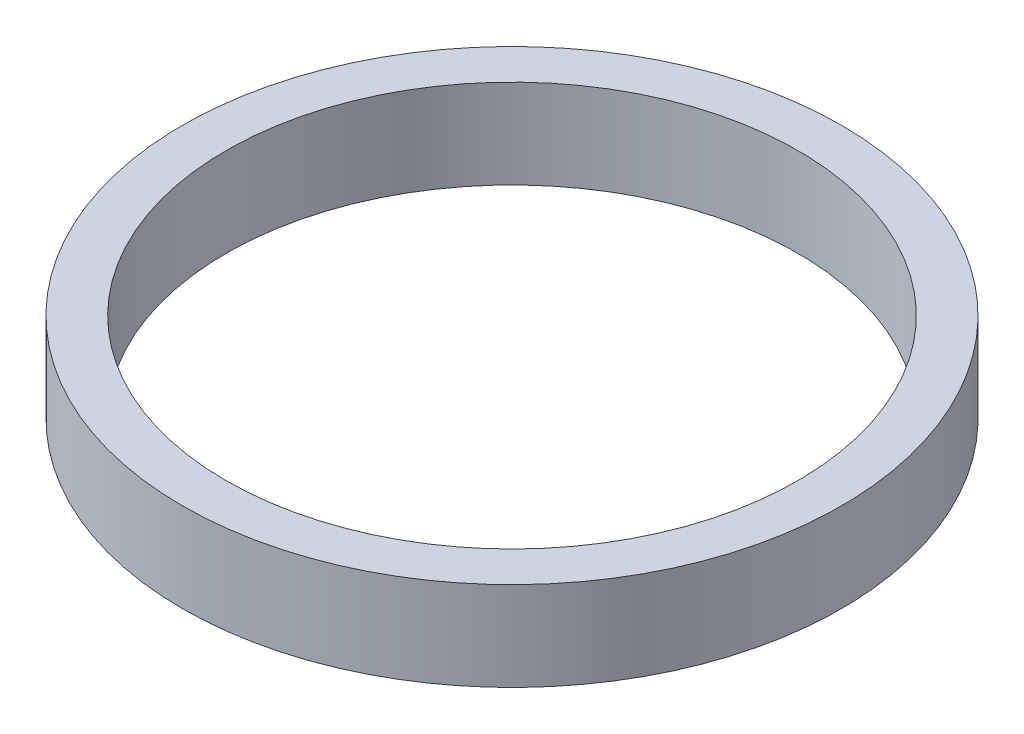
ISO-10303-21;
HEADER;
FILE_DESCRIPTION(('STEP AP214'),'2;1');
FILE_NAME('part.step','',(''),(''),'','','');
FILE_SCHEMA(('AUTOMOTIVE_DESIGN { 1 0 10303 214 1 1 1 1 }'));
ENDSEC;
DATA;
#1=APPLICATION_CONTEXT('core data for automotive mechanical design processes');
#2=APPLICATION_PROTOCOL_DEFINITION('international standard','automotive_design',2000,#1);
#3=PRODUCT_CONTEXT('',#1,'mechanical');
#4=PRODUCT('Part','Part','',(#3));
#5=PRODUCT_RELATED_PRODUCT_CATEGORY('part','',(#4));
#6=PRODUCT_DEFINITION_FORMATION('','',#4);
#7=PRODUCT_DEFINITION_CONTEXT('part definition',#1,'design');
#8=PRODUCT_DEFINITION('design','',#6,#7);
#9=PRODUCT_DEFINITION_SHAPE('','',#8);
#10=(LENGTH_UNIT() NAMED_UNIT(*) SI_UNIT(.MILLI.,.METRE.));
#11=(NAMED_UNIT(*) PLANE_ANGLE_UNIT() SI_UNIT($,.RADIAN.));
#12=(NAMED_UNIT(*) SI_UNIT($,.STERADIAN.) SOLID_ANGLE_UNIT());
#13=UNCERTAINTY_MEASURE_WITH_UNIT(LENGTH_MEASURE(1.E-05),#10,'distance_accuracy_value','');
#14=(GEOMETRIC_REPRESENTATION_CONTEXT(3) GLOBAL_UNCERTAINTY_ASSIGNED_CONTEXT((#13)) GLOBAL_UNIT_ASSIGNED_CONTEXT((#10,
#11,#12)) REPRESENTATION_CONTEXT('',''));
#15=CARTESIAN_POINT('',(0.,0.,0.));
#16=DIRECTION('',(0.,0.,1.));
#17=DIRECTION('',(1.,0.,0.));
#18=AXIS2_PLACEMENT_3D('',#15,#16,#17);
#19=CARTESIAN_POINT('',(-0.499999999999999,14.,0.));
#20=DIRECTION('',(0.,1.,0.));
#21=DIRECTION('',(0.,0.,1.));
#22=AXIS2_PLACEMENT_3D('',#19,#20,#21);
#23=PLANE('',#22);
#24=CARTESIAN_POINT('',(-0.499999999999999,14.,0.));
#25=DIRECTION('',(0.,1.,0.));
#26=DIRECTION('',(0.,0.,1.));
#27=AXIS2_PLACEMENT_3D('',#24,#25,#26);
#28=CIRCLE('',#27,18.5);
#29=CARTESIAN_POINT('',(-0.499999999999999,14.,18.5));
#30=VERTEX_POINT('',#29);
#31=EDGE_CURVE('E10',#30,#30,#28,.T.);
#32=ORIENTED_EDGE('',*,*,#31,.T.);
#33=EDGE_LOOP('',(#32));
#34=FACE_BOUND('',#33,.T.);
#35=CARTESIAN_POINT('',(-0.499999999999999,14.,0.));
#36=DIRECTION('',(0.,1.,0.));
#37=DIRECTION('',(0.,0.,1.));
#38=AXIS2_PLACEMENT_3D('',#35,#36,#37);
#39=CIRCLE('',#38,16.05);
#40=CARTESIAN_POINT('',(-0.499999999999999,14.,16.05));
#41=VERTEX_POINT('',#40);
#42=EDGE_CURVE('E48',#41,#41,#39,.T.);
#43=ORIENTED_EDGE('',*,*,#42,.F.);
#44=EDGE_LOOP('',(#43));
#45=FACE_BOUND('',#44,.T.);
#46=ADVANCED_FACE('F40',(#34,#45),#23,.T.);
#47=CARTESIAN_POINT('',(-0.499999999999999,8.99999999999999,0.));
#48=DIRECTION('',(0.,1.,0.));
#49=DIRECTION('',(0.,0.,1.));
#50=AXIS2_PLACEMENT_3D('',#47,#48,#49);
#51=PLANE('',#50);
#52=CARTESIAN_POINT('',(-0.499999999999999,8.99999999999999,0.));
#53=DIRECTION('',(0.,1.,0.));
#54=DIRECTION('',(0.,0.,1.));
#55=AXIS2_PLACEMENT_3D('',#52,#53,#54);
#56=CIRCLE('',#55,18.5);
#57=CARTESIAN_POINT('',(-0.499999999999999,8.99999999999999,18.5));
#58=VERTEX_POINT('',#57);
#59=EDGE_CURVE('E41',#58,#58,#56,.T.);
#60=ORIENTED_EDGE('',*,*,#59,.F.);
#61=EDGE_LOOP('',(#60));
#62=FACE_BOUND('',#61,.T.);
#63=CARTESIAN_POINT('',(-0.499999999999999,8.99999999999999,0.));
#64=DIRECTION('',(0.,1.,0.));
#65=DIRECTION('',(0.,0.,1.));
#66=AXIS2_PLACEMENT_3D('',#63,#64,#65);
#67=CIRCLE('',#66,16.05);
#68=CARTESIAN_POINT('',(-0.499999999999999,8.99999999999999,16.05));
#69=VERTEX_POINT('',#68);
#70=EDGE_CURVE('E49',#69,#69,#67,.T.);
#71=ORIENTED_EDGE('',*,*,#70,.T.);
#72=EDGE_LOOP('',(#71));
#73=FACE_BOUND('',#72,.T.);
#74=ADVANCED_FACE('F58',(#62,#73),#51,.F.);
#75=CARTESIAN_POINT('',(-0.499999999999999,14.,0.));
#76=DIRECTION('',(0.,-1.,0.));
#77=DIRECTION('',(0.,0.,-1.));
#78=AXIS2_PLACEMENT_3D('',#75,#76,#77);
#79=CYLINDRICAL_SURFACE('',#78,18.5);
#80=ORIENTED_EDGE('',*,*,#31,.F.);
#81=EDGE_LOOP('',(#80));
#82=FACE_BOUND('',#81,.T.);
#83=ORIENTED_EDGE('',*,*,#59,.T.);
#84=EDGE_LOOP('',(#83));
#85=FACE_BOUND('',#84,.T.);
#86=ADVANCED_FACE('F39',(#82,#85),#79,.T.);
#87=CARTESIAN_POINT('',(-0.499999999999999,14.,0.));
#88=DIRECTION('',(0.,-1.,0.));
#89=DIRECTION('',(0.,0.,-1.));
#90=AXIS2_PLACEMENT_3D('',#87,#88,#89);
#91=CYLINDRICAL_SURFACE('',#90,16.05);
#92=ORIENTED_EDGE('',*,*,#42,.T.);
#93=EDGE_LOOP('',(#92));
#94=FACE_BOUND('',#93,.T.);
#95=ORIENTED_EDGE('',*,*,#70,.F.);
#96=EDGE_LOOP('',(#95));
#97=FACE_BOUND('',#96,.T.);
#98=ADVANCED_FACE('F57',(#94,#97),#91,.F.);
#99=CLOSED_SHELL('',(#46,#74,#86,#98));
#100=MANIFOLD_SOLID_BREP('B2',#99);
#101=ADVANCED_BREP_SHAPE_REPRESENTATION('',(#18,#100),#14);
#102=SHAPE_DEFINITION_REPRESENTATION(#9,#101);
ENDSEC;
END-ISO-10303-21;
